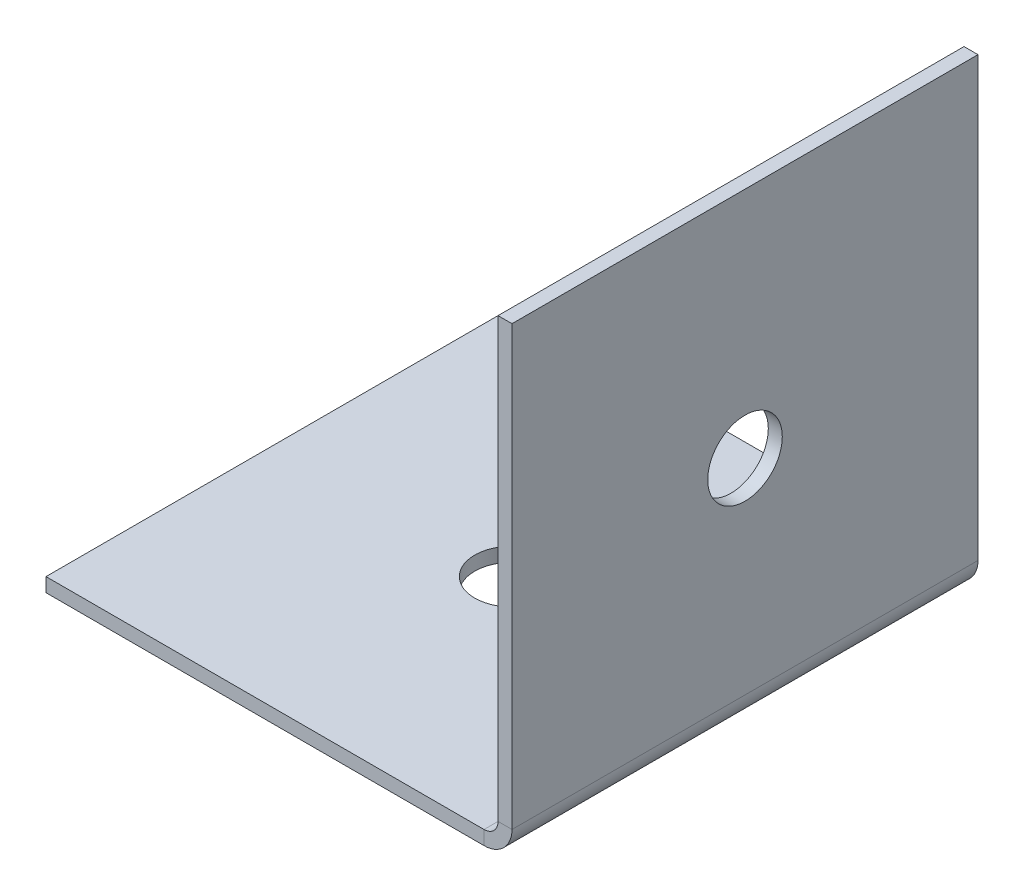
ISO-10303-21;
HEADER;
FILE_DESCRIPTION(('STEP AP214'),'2;1');
FILE_NAME('part.step','',(''),(''),'','','');
FILE_SCHEMA(('AUTOMOTIVE_DESIGN { 1 0 10303 214 1 1 1 1 }'));
ENDSEC;
DATA;
#1=APPLICATION_CONTEXT('core data for automotive mechanical design processes');
#2=APPLICATION_PROTOCOL_DEFINITION('international standard','automotive_design',2000,#1);
#3=PRODUCT_CONTEXT('',#1,'mechanical');
#4=PRODUCT('Part','Part','',(#3));
#5=PRODUCT_RELATED_PRODUCT_CATEGORY('part','',(#4));
#6=PRODUCT_DEFINITION_FORMATION('','',#4);
#7=PRODUCT_DEFINITION_CONTEXT('part definition',#1,'design');
#8=PRODUCT_DEFINITION('design','',#6,#7);
#9=PRODUCT_DEFINITION_SHAPE('','',#8);
#10=(LENGTH_UNIT() NAMED_UNIT(*) SI_UNIT(.MILLI.,.METRE.));
#11=(NAMED_UNIT(*) PLANE_ANGLE_UNIT() SI_UNIT($,.RADIAN.));
#12=(NAMED_UNIT(*) SI_UNIT($,.STERADIAN.) SOLID_ANGLE_UNIT());
#13=UNCERTAINTY_MEASURE_WITH_UNIT(LENGTH_MEASURE(1.E-05),#10,'distance_accuracy_value','');
#14=(GEOMETRIC_REPRESENTATION_CONTEXT(3) GLOBAL_UNCERTAINTY_ASSIGNED_CONTEXT((#13)) GLOBAL_UNIT_ASSIGNED_CONTEXT((#10,
#11,#12)) REPRESENTATION_CONTEXT('',''));
#15=CARTESIAN_POINT('',(0.,0.,0.));
#16=DIRECTION('',(0.,0.,1.));
#17=DIRECTION('',(1.,0.,0.));
#18=AXIS2_PLACEMENT_3D('',#15,#16,#17);
#19=CARTESIAN_POINT('',(12.7,0.762,-12.7));
#20=DIRECTION('',(0.,0.,-1.));
#21=DIRECTION('',(0.,-1.,0.));
#22=AXIS2_PLACEMENT_3D('',#19,#20,#21);
#23=PLANE('',#22);
#24=DIRECTION('',(1.,0.,0.));
#25=VECTOR('',#24,1.);
#26=CARTESIAN_POINT('',(12.7,1.524,-12.7));
#27=LINE('',#26,#25);
#28=CARTESIAN_POINT('',(11.938,1.524,-12.7));
#29=VERTEX_POINT('',#28);
#30=CARTESIAN_POINT('',(12.7,1.524,-12.7));
#31=VERTEX_POINT('',#30);
#32=EDGE_CURVE('E11',#29,#31,#27,.T.);
#33=ORIENTED_EDGE('',*,*,#32,.F.);
#34=DIRECTION('',(0.,1.,0.));
#35=VECTOR('',#34,1.);
#36=CARTESIAN_POINT('',(11.938,0.762,-12.7));
#37=LINE('',#36,#35);
#38=CARTESIAN_POINT('',(11.938,25.4,-12.7));
#39=VERTEX_POINT('',#38);
#40=EDGE_CURVE('E88',#39,#29,#37,.F.);
#41=ORIENTED_EDGE('',*,*,#40,.F.);
#42=DIRECTION('',(1.,0.,0.));
#43=VECTOR('',#42,1.);
#44=CARTESIAN_POINT('',(12.7,25.4,-12.7));
#45=LINE('',#44,#43);
#46=CARTESIAN_POINT('',(12.7,25.4,-12.7));
#47=VERTEX_POINT('',#46);
#48=EDGE_CURVE('E48',#39,#47,#45,.T.);
#49=ORIENTED_EDGE('',*,*,#48,.T.);
#50=DIRECTION('',(0.,-1.,0.));
#51=VECTOR('',#50,1.);
#52=CARTESIAN_POINT('',(12.7,0.762,-12.7));
#53=LINE('',#52,#51);
#54=EDGE_CURVE('E91',#47,#31,#53,.T.);
#55=ORIENTED_EDGE('',*,*,#54,.T.);
#56=EDGE_LOOP('',(#33,#41,#49,#55));
#57=FACE_BOUND('',#56,.T.);
#58=ADVANCED_FACE('F38',(#57),#23,.T.);
#59=CARTESIAN_POINT('',(12.7,25.4,12.7));
#60=DIRECTION('',(0.,-1.,0.));
#61=DIRECTION('',(0.,0.,1.));
#62=AXIS2_PLACEMENT_3D('',#59,#60,#61);
#63=PLANE('',#62);
#64=ORIENTED_EDGE('',*,*,#48,.F.);
#65=DIRECTION('',(0.,0.,1.));
#66=VECTOR('',#65,1.);
#67=CARTESIAN_POINT('',(11.938,25.4,0.));
#68=LINE('',#67,#66);
#69=CARTESIAN_POINT('',(11.938,25.4,12.7));
#70=VERTEX_POINT('',#69);
#71=EDGE_CURVE('E117',#39,#70,#68,.T.);
#72=ORIENTED_EDGE('',*,*,#71,.T.);
#73=DIRECTION('',(1.,0.,0.));
#74=VECTOR('',#73,1.);
#75=CARTESIAN_POINT('',(12.7,25.4,12.7));
#76=LINE('',#75,#74);
#77=CARTESIAN_POINT('',(12.7,25.4,12.7));
#78=VERTEX_POINT('',#77);
#79=EDGE_CURVE('E141',#70,#78,#76,.T.);
#80=ORIENTED_EDGE('',*,*,#79,.T.);
#81=DIRECTION('',(0.,0.,1.));
#82=VECTOR('',#81,1.);
#83=CARTESIAN_POINT('',(12.7,25.4,12.7));
#84=LINE('',#83,#82);
#85=EDGE_CURVE('E153',#47,#78,#84,.T.);
#86=ORIENTED_EDGE('',*,*,#85,.F.);
#87=EDGE_LOOP('',(#64,#72,#80,#86));
#88=FACE_BOUND('',#87,.T.);
#89=ADVANCED_FACE('F159',(#88),#63,.F.);
#90=CARTESIAN_POINT('',(12.7,0.762,12.7));
#91=DIRECTION('',(0.,0.,-1.));
#92=DIRECTION('',(0.,-1.,0.));
#93=AXIS2_PLACEMENT_3D('',#90,#91,#92);
#94=PLANE('',#93);
#95=ORIENTED_EDGE('',*,*,#79,.F.);
#96=DIRECTION('',(0.,1.,0.));
#97=VECTOR('',#96,1.);
#98=CARTESIAN_POINT('',(11.938,0.762,12.7));
#99=LINE('',#98,#97);
#100=CARTESIAN_POINT('',(11.938,1.524,12.7));
#101=VERTEX_POINT('',#100);
#102=EDGE_CURVE('E130',#70,#101,#99,.F.);
#103=ORIENTED_EDGE('',*,*,#102,.T.);
#104=DIRECTION('',(1.,0.,0.));
#105=VECTOR('',#104,1.);
#106=CARTESIAN_POINT('',(12.7,1.524,12.7));
#107=LINE('',#106,#105);
#108=CARTESIAN_POINT('',(12.7,1.524,12.7));
#109=VERTEX_POINT('',#108);
#110=EDGE_CURVE('E138',#101,#109,#107,.T.);
#111=ORIENTED_EDGE('',*,*,#110,.T.);
#112=DIRECTION('',(0.,-1.,0.));
#113=VECTOR('',#112,1.);
#114=CARTESIAN_POINT('',(12.7,0.762,12.7));
#115=LINE('',#114,#113);
#116=EDGE_CURVE('E160',#78,#109,#115,.T.);
#117=ORIENTED_EDGE('',*,*,#116,.F.);
#118=EDGE_LOOP('',(#95,#103,#111,#117));
#119=FACE_BOUND('',#118,.T.);
#120=ADVANCED_FACE('F197',(#119),#94,.F.);
#121=CARTESIAN_POINT('',(11.176,1.524,12.7));
#122=DIRECTION('',(0.,0.,1.));
#123=DIRECTION('',(1.,0.,0.));
#124=AXIS2_PLACEMENT_3D('',#121,#122,#123);
#125=PLANE('',#124);
#126=ORIENTED_EDGE('',*,*,#110,.F.);
#127=CARTESIAN_POINT('',(11.176,1.524,12.7));
#128=DIRECTION('',(0.,0.,-1.));
#129=DIRECTION('',(-1.,0.,0.));
#130=AXIS2_PLACEMENT_3D('',#127,#128,#129);
#131=CIRCLE('',#130,0.762);
#132=CARTESIAN_POINT('',(11.176,0.762,12.7));
#133=VERTEX_POINT('',#132);
#134=EDGE_CURVE('E106',#101,#133,#131,.T.);
#135=ORIENTED_EDGE('',*,*,#134,.T.);
#136=DIRECTION('',(0.,-1.,0.));
#137=VECTOR('',#136,1.);
#138=CARTESIAN_POINT('',(11.176,0.,12.7));
#139=LINE('',#138,#137);
#140=CARTESIAN_POINT('',(11.176,0.,12.7));
#141=VERTEX_POINT('',#140);
#142=EDGE_CURVE('E56',#133,#141,#139,.T.);
#143=ORIENTED_EDGE('',*,*,#142,.T.);
#144=CARTESIAN_POINT('',(11.176,1.524,12.7));
#145=DIRECTION('',(0.,0.,-1.));
#146=DIRECTION('',(-1.,0.,0.));
#147=AXIS2_PLACEMENT_3D('',#144,#145,#146);
#148=CIRCLE('',#147,1.524);
#149=EDGE_CURVE('E157',#109,#141,#148,.T.);
#150=ORIENTED_EDGE('',*,*,#149,.F.);
#151=EDGE_LOOP('',(#126,#135,#143,#150));
#152=FACE_BOUND('',#151,.T.);
#153=ADVANCED_FACE('F200',(#152),#125,.T.);
#154=CARTESIAN_POINT('',(0.,0.,12.7));
#155=DIRECTION('',(0.,0.,1.));
#156=DIRECTION('',(1.,0.,0.));
#157=AXIS2_PLACEMENT_3D('',#154,#155,#156);
#158=PLANE('',#157);
#159=ORIENTED_EDGE('',*,*,#142,.F.);
#160=DIRECTION('',(1.,0.,0.));
#161=VECTOR('',#160,1.);
#162=CARTESIAN_POINT('',(0.,0.762,12.7));
#163=LINE('',#162,#161);
#164=CARTESIAN_POINT('',(-12.7,0.762,12.7));
#165=VERTEX_POINT('',#164);
#166=EDGE_CURVE('E191',#165,#133,#163,.T.);
#167=ORIENTED_EDGE('',*,*,#166,.F.);
#168=DIRECTION('',(0.,-1.,0.));
#169=VECTOR('',#168,1.);
#170=CARTESIAN_POINT('',(-12.7,0.,12.7));
#171=LINE('',#170,#169);
#172=CARTESIAN_POINT('',(-12.7,0.,12.7));
#173=VERTEX_POINT('',#172);
#174=EDGE_CURVE('E134',#165,#173,#171,.T.);
#175=ORIENTED_EDGE('',*,*,#174,.T.);
#176=DIRECTION('',(1.,0.,0.));
#177=VECTOR('',#176,1.);
#178=CARTESIAN_POINT('',(0.,0.,12.7));
#179=LINE('',#178,#177);
#180=EDGE_CURVE('E173',#173,#141,#179,.T.);
#181=ORIENTED_EDGE('',*,*,#180,.T.);
#182=EDGE_LOOP('',(#159,#167,#175,#181));
#183=FACE_BOUND('',#182,.T.);
#184=ADVANCED_FACE('F211',(#183),#158,.T.);
#185=CARTESIAN_POINT('',(-12.7,0.,0.));
#186=DIRECTION('',(1.,0.,0.));
#187=DIRECTION('',(0.,0.,-1.));
#188=AXIS2_PLACEMENT_3D('',#185,#186,#187);
#189=PLANE('',#188);
#190=ORIENTED_EDGE('',*,*,#174,.F.);
#191=DIRECTION('',(0.,0.,1.));
#192=VECTOR('',#191,1.);
#193=CARTESIAN_POINT('',(-12.7,0.762,0.));
#194=LINE('',#193,#192);
#195=CARTESIAN_POINT('',(-12.7,0.762,-12.7));
#196=VERTEX_POINT('',#195);
#197=EDGE_CURVE('E111',#165,#196,#194,.F.);
#198=ORIENTED_EDGE('',*,*,#197,.T.);
#199=DIRECTION('',(0.,-1.,0.));
#200=VECTOR('',#199,1.);
#201=CARTESIAN_POINT('',(-12.7,0.,-12.7));
#202=LINE('',#201,#200);
#203=CARTESIAN_POINT('',(-12.7,0.,-12.7));
#204=VERTEX_POINT('',#203);
#205=EDGE_CURVE('E131',#196,#204,#202,.T.);
#206=ORIENTED_EDGE('',*,*,#205,.T.);
#207=DIRECTION('',(0.,0.,-1.));
#208=VECTOR('',#207,1.);
#209=CARTESIAN_POINT('',(-12.7,0.,0.));
#210=LINE('',#209,#208);
#211=EDGE_CURVE('E176',#173,#204,#210,.T.);
#212=ORIENTED_EDGE('',*,*,#211,.F.);
#213=EDGE_LOOP('',(#190,#198,#206,#212));
#214=FACE_BOUND('',#213,.T.);
#215=ADVANCED_FACE('F217',(#214),#189,.F.);
#216=CARTESIAN_POINT('',(0.,0.,-12.7));
#217=DIRECTION('',(0.,0.,1.));
#218=DIRECTION('',(1.,0.,0.));
#219=AXIS2_PLACEMENT_3D('',#216,#217,#218);
#220=PLANE('',#219);
#221=ORIENTED_EDGE('',*,*,#205,.F.);
#222=DIRECTION('',(1.,0.,0.));
#223=VECTOR('',#222,1.);
#224=CARTESIAN_POINT('',(0.,0.762,-12.7));
#225=LINE('',#224,#223);
#226=CARTESIAN_POINT('',(11.176,0.762,-12.7));
#227=VERTEX_POINT('',#226);
#228=EDGE_CURVE('E189',#196,#227,#225,.T.);
#229=ORIENTED_EDGE('',*,*,#228,.T.);
#230=DIRECTION('',(0.,-1.,0.));
#231=VECTOR('',#230,1.);
#232=CARTESIAN_POINT('',(11.176,0.,-12.7));
#233=LINE('',#232,#231);
#234=CARTESIAN_POINT('',(11.176,0.,-12.7));
#235=VERTEX_POINT('',#234);
#236=EDGE_CURVE('E42',#227,#235,#233,.T.);
#237=ORIENTED_EDGE('',*,*,#236,.T.);
#238=DIRECTION('',(1.,0.,0.));
#239=VECTOR('',#238,1.);
#240=CARTESIAN_POINT('',(0.,0.,-12.7));
#241=LINE('',#240,#239);
#242=EDGE_CURVE('E170',#204,#235,#241,.T.);
#243=ORIENTED_EDGE('',*,*,#242,.F.);
#244=EDGE_LOOP('',(#221,#229,#237,#243));
#245=FACE_BOUND('',#244,.T.);
#246=ADVANCED_FACE('F221',(#245),#220,.F.);
#247=CARTESIAN_POINT('',(12.7,12.7,0.));
#248=DIRECTION('',(1.,0.,0.));
#249=DIRECTION('',(0.,0.,-1.));
#250=AXIS2_PLACEMENT_3D('',#247,#248,#249);
#251=CYLINDRICAL_SURFACE('',#250,2.032);
#252=CARTESIAN_POINT('',(12.7,12.7,0.));
#253=DIRECTION('',(1.,0.,0.));
#254=DIRECTION('',(0.,0.,-1.));
#255=AXIS2_PLACEMENT_3D('',#252,#253,#254);
#256=CIRCLE('',#255,2.032);
#257=CARTESIAN_POINT('',(12.7,12.7,-2.03199999999999));
#258=VERTEX_POINT('',#257);
#259=EDGE_CURVE('E162',#258,#258,#256,.T.);
#260=ORIENTED_EDGE('',*,*,#259,.T.);
#261=EDGE_LOOP('',(#260));
#262=FACE_BOUND('',#261,.T.);
#263=CARTESIAN_POINT('',(11.938,12.7,0.));
#264=DIRECTION('',(1.,0.,0.));
#265=DIRECTION('',(0.,0.,-1.));
#266=AXIS2_PLACEMENT_3D('',#263,#264,#265);
#267=CIRCLE('',#266,2.032);
#268=CARTESIAN_POINT('',(11.938,12.7,-2.03199999999999));
#269=VERTEX_POINT('',#268);
#270=EDGE_CURVE('E126',#269,#269,#267,.T.);
#271=ORIENTED_EDGE('',*,*,#270,.F.);
#272=EDGE_LOOP('',(#271));
#273=FACE_BOUND('',#272,.T.);
#274=ADVANCED_FACE('F40',(#262,#273),#251,.F.);
#275=CARTESIAN_POINT('',(0.,0.,0.));
#276=DIRECTION('',(0.,1.,0.));
#277=DIRECTION('',(0.,0.,1.));
#278=AXIS2_PLACEMENT_3D('',#275,#276,#277);
#279=CYLINDRICAL_SURFACE('',#278,2.032);
#280=CARTESIAN_POINT('',(0.,0.,0.));
#281=DIRECTION('',(0.,1.,0.));
#282=DIRECTION('',(0.,0.,1.));
#283=AXIS2_PLACEMENT_3D('',#280,#281,#282);
#284=CIRCLE('',#283,2.032);
#285=CARTESIAN_POINT('',(0.,0.,2.032));
#286=VERTEX_POINT('',#285);
#287=EDGE_CURVE('E167',#286,#286,#284,.T.);
#288=ORIENTED_EDGE('',*,*,#287,.F.);
#289=EDGE_LOOP('',(#288));
#290=FACE_BOUND('',#289,.T.);
#291=CARTESIAN_POINT('',(0.,0.762,0.));
#292=DIRECTION('',(0.,1.,0.));
#293=DIRECTION('',(0.,0.,1.));
#294=AXIS2_PLACEMENT_3D('',#291,#292,#293);
#295=CIRCLE('',#294,2.032);
#296=CARTESIAN_POINT('',(0.,0.762,2.032));
#297=VERTEX_POINT('',#296);
#298=EDGE_CURVE('E129',#297,#297,#295,.T.);
#299=ORIENTED_EDGE('',*,*,#298,.T.);
#300=EDGE_LOOP('',(#299));
#301=FACE_BOUND('',#300,.T.);
#302=ADVANCED_FACE('F242',(#290,#301),#279,.F.);
#303=CARTESIAN_POINT('',(11.176,1.524,-12.7));
#304=DIRECTION('',(0.,0.,-1.));
#305=DIRECTION('',(-1.,0.,0.));
#306=AXIS2_PLACEMENT_3D('',#303,#304,#305);
#307=PLANE('',#306);
#308=CARTESIAN_POINT('',(11.176,1.524,-12.7));
#309=DIRECTION('',(0.,0.,-1.));
#310=DIRECTION('',(-1.,0.,0.));
#311=AXIS2_PLACEMENT_3D('',#308,#309,#310);
#312=CIRCLE('',#311,0.762);
#313=EDGE_CURVE('E104',#227,#29,#312,.F.);
#314=ORIENTED_EDGE('',*,*,#313,.T.);
#315=ORIENTED_EDGE('',*,*,#32,.T.);
#316=CARTESIAN_POINT('',(11.176,1.524,-12.7));
#317=DIRECTION('',(0.,0.,1.));
#318=DIRECTION('',(1.,0.,0.));
#319=AXIS2_PLACEMENT_3D('',#316,#317,#318);
#320=CIRCLE('',#319,1.524);
#321=EDGE_CURVE('E183',#235,#31,#320,.T.);
#322=ORIENTED_EDGE('',*,*,#321,.F.);
#323=ORIENTED_EDGE('',*,*,#236,.F.);
#324=EDGE_LOOP('',(#314,#315,#322,#323));
#325=FACE_BOUND('',#324,.T.);
#326=ADVANCED_FACE('F120',(#325),#307,.T.);
#327=CARTESIAN_POINT('',(0.,0.,0.));
#328=DIRECTION('',(0.,1.,0.));
#329=DIRECTION('',(0.,0.,1.));
#330=AXIS2_PLACEMENT_3D('',#327,#328,#329);
#331=PLANE('',#330);
#332=ORIENTED_EDGE('',*,*,#287,.T.);
#333=EDGE_LOOP('',(#332));
#334=FACE_BOUND('',#333,.T.);
#335=ORIENTED_EDGE('',*,*,#242,.T.);
#336=DIRECTION('',(0.,0.,-1.));
#337=VECTOR('',#336,1.);
#338=CARTESIAN_POINT('',(11.176,0.,0.));
#339=LINE('',#338,#337);
#340=EDGE_CURVE('E180',#235,#141,#339,.F.);
#341=ORIENTED_EDGE('',*,*,#340,.T.);
#342=ORIENTED_EDGE('',*,*,#180,.F.);
#343=ORIENTED_EDGE('',*,*,#211,.T.);
#344=EDGE_LOOP('',(#335,#341,#342,#343));
#345=FACE_BOUND('',#344,.T.);
#346=ADVANCED_FACE('F216',(#334,#345),#331,.F.);
#347=CARTESIAN_POINT('',(12.7,0.762,0.));
#348=DIRECTION('',(-1.,0.,0.));
#349=DIRECTION('',(0.,0.,1.));
#350=AXIS2_PLACEMENT_3D('',#347,#348,#349);
#351=PLANE('',#350);
#352=ORIENTED_EDGE('',*,*,#116,.T.);
#353=DIRECTION('',(0.,0.,-1.));
#354=VECTOR('',#353,1.);
#355=CARTESIAN_POINT('',(12.7,1.524,0.));
#356=LINE('',#355,#354);
#357=EDGE_CURVE('E156',#109,#31,#356,.T.);
#358=ORIENTED_EDGE('',*,*,#357,.T.);
#359=ORIENTED_EDGE('',*,*,#54,.F.);
#360=ORIENTED_EDGE('',*,*,#85,.T.);
#361=EDGE_LOOP('',(#352,#358,#359,#360));
#362=FACE_BOUND('',#361,.T.);
#363=ORIENTED_EDGE('',*,*,#259,.F.);
#364=EDGE_LOOP('',(#363));
#365=FACE_BOUND('',#364,.T.);
#366=ADVANCED_FACE('F151',(#362,#365),#351,.F.);
#367=CARTESIAN_POINT('',(11.176,1.524,0.));
#368=DIRECTION('',(0.,0.,-1.));
#369=DIRECTION('',(-1.,0.,0.));
#370=AXIS2_PLACEMENT_3D('',#367,#368,#369);
#371=CYLINDRICAL_SURFACE('',#370,1.524);
#372=ORIENTED_EDGE('',*,*,#149,.T.);
#373=ORIENTED_EDGE('',*,*,#340,.F.);
#374=ORIENTED_EDGE('',*,*,#321,.T.);
#375=ORIENTED_EDGE('',*,*,#357,.F.);
#376=EDGE_LOOP('',(#372,#373,#374,#375));
#377=FACE_BOUND('',#376,.T.);
#378=ADVANCED_FACE('F203',(#377),#371,.T.);
#379=CARTESIAN_POINT('',(0.,0.762,0.));
#380=DIRECTION('',(0.,1.,0.));
#381=DIRECTION('',(0.,0.,1.));
#382=AXIS2_PLACEMENT_3D('',#379,#380,#381);
#383=PLANE('',#382);
#384=ORIENTED_EDGE('',*,*,#298,.F.);
#385=EDGE_LOOP('',(#384));
#386=FACE_BOUND('',#385,.T.);
#387=ORIENTED_EDGE('',*,*,#228,.F.);
#388=ORIENTED_EDGE('',*,*,#197,.F.);
#389=ORIENTED_EDGE('',*,*,#166,.T.);
#390=DIRECTION('',(0.,0.,1.));
#391=VECTOR('',#390,1.);
#392=CARTESIAN_POINT('',(11.176,0.762,0.));
#393=LINE('',#392,#391);
#394=EDGE_CURVE('E110',#227,#133,#393,.T.);
#395=ORIENTED_EDGE('',*,*,#394,.F.);
#396=EDGE_LOOP('',(#387,#388,#389,#395));
#397=FACE_BOUND('',#396,.T.);
#398=ADVANCED_FACE('F223',(#386,#397),#383,.T.);
#399=CARTESIAN_POINT('',(11.938,0.762,0.));
#400=DIRECTION('',(-1.,0.,0.));
#401=DIRECTION('',(0.,0.,1.));
#402=AXIS2_PLACEMENT_3D('',#399,#400,#401);
#403=PLANE('',#402);
#404=ORIENTED_EDGE('',*,*,#102,.F.);
#405=ORIENTED_EDGE('',*,*,#71,.F.);
#406=ORIENTED_EDGE('',*,*,#40,.T.);
#407=DIRECTION('',(0.,0.,1.));
#408=VECTOR('',#407,1.);
#409=CARTESIAN_POINT('',(11.938,1.524,0.));
#410=LINE('',#409,#408);
#411=EDGE_CURVE('E101',#101,#29,#410,.F.);
#412=ORIENTED_EDGE('',*,*,#411,.F.);
#413=EDGE_LOOP('',(#404,#405,#406,#412));
#414=FACE_BOUND('',#413,.T.);
#415=ORIENTED_EDGE('',*,*,#270,.T.);
#416=EDGE_LOOP('',(#415));
#417=FACE_BOUND('',#416,.T.);
#418=ADVANCED_FACE('F114',(#414,#417),#403,.T.);
#419=CARTESIAN_POINT('',(11.176,1.524,0.));
#420=DIRECTION('',(0.,0.,-1.));
#421=DIRECTION('',(-1.,0.,0.));
#422=AXIS2_PLACEMENT_3D('',#419,#420,#421);
#423=CYLINDRICAL_SURFACE('',#422,0.762);
#424=ORIENTED_EDGE('',*,*,#134,.F.);
#425=ORIENTED_EDGE('',*,*,#411,.T.);
#426=ORIENTED_EDGE('',*,*,#313,.F.);
#427=ORIENTED_EDGE('',*,*,#394,.T.);
#428=EDGE_LOOP('',(#424,#425,#426,#427));
#429=FACE_BOUND('',#428,.T.);
#430=ADVANCED_FACE('F102',(#429),#423,.F.);
#431=CLOSED_SHELL('',(#58,#89,#120,#153,#184,#215,#246,#274,#302,#326,#346,#366,#378,#398,#418,#430));
#432=MANIFOLD_SOLID_BREP('B2',#431);
#433=ADVANCED_BREP_SHAPE_REPRESENTATION('',(#18,#432),#14);
#434=SHAPE_DEFINITION_REPRESENTATION(#9,#433);
ENDSEC;
END-ISO-10303-21;
